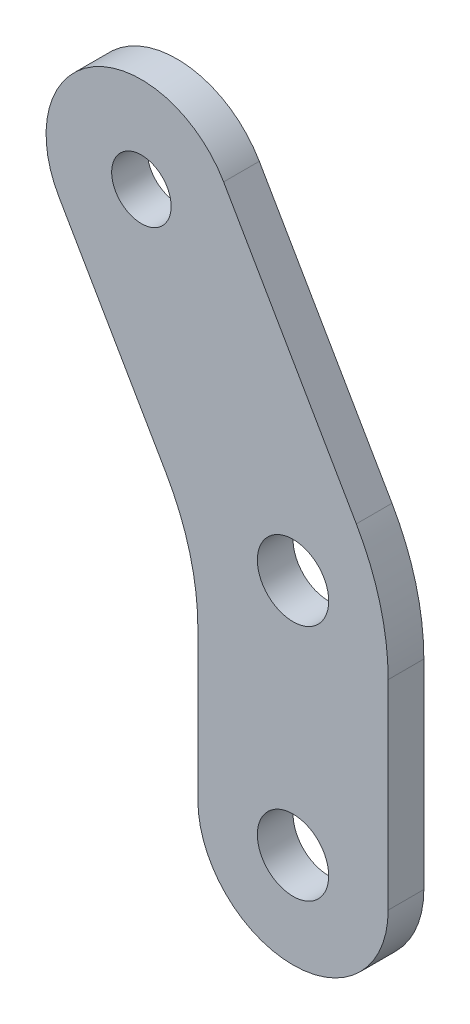
ISO-10303-21;
HEADER;
FILE_DESCRIPTION(('STEP AP214'),'2;1');
FILE_NAME('part.step','',(''),(''),'','','');
FILE_SCHEMA(('AUTOMOTIVE_DESIGN { 1 0 10303 214 1 1 1 1 }'));
ENDSEC;
DATA;
#1=APPLICATION_CONTEXT('core data for automotive mechanical design processes');
#2=APPLICATION_PROTOCOL_DEFINITION('international standard','automotive_design',2000,#1);
#3=PRODUCT_CONTEXT('',#1,'mechanical');
#4=PRODUCT('Part','Part','',(#3));
#5=PRODUCT_RELATED_PRODUCT_CATEGORY('part','',(#4));
#6=PRODUCT_DEFINITION_FORMATION('','',#4);
#7=PRODUCT_DEFINITION_CONTEXT('part definition',#1,'design');
#8=PRODUCT_DEFINITION('design','',#6,#7);
#9=PRODUCT_DEFINITION_SHAPE('','',#8);
#10=(LENGTH_UNIT() NAMED_UNIT(*) SI_UNIT(.MILLI.,.METRE.));
#11=(NAMED_UNIT(*) PLANE_ANGLE_UNIT() SI_UNIT($,.RADIAN.));
#12=(NAMED_UNIT(*) SI_UNIT($,.STERADIAN.) SOLID_ANGLE_UNIT());
#13=UNCERTAINTY_MEASURE_WITH_UNIT(LENGTH_MEASURE(1.E-05),#10,'distance_accuracy_value','');
#14=(GEOMETRIC_REPRESENTATION_CONTEXT(3) GLOBAL_UNCERTAINTY_ASSIGNED_CONTEXT((#13)) GLOBAL_UNIT_ASSIGNED_CONTEXT((#10,
#11,#12)) REPRESENTATION_CONTEXT('',''));
#15=CARTESIAN_POINT('',(0.,0.,0.));
#16=DIRECTION('',(0.,0.,1.));
#17=DIRECTION('',(1.,0.,0.));
#18=AXIS2_PLACEMENT_3D('',#15,#16,#17);
#19=CARTESIAN_POINT('',(0.,0.,3.));
#20=DIRECTION('',(0.,0.,1.));
#21=DIRECTION('',(1.,0.,0.));
#22=AXIS2_PLACEMENT_3D('',#19,#20,#21);
#23=PLANE('',#22);
#24=CARTESIAN_POINT('',(-12.7497839742892,42.1122667237108,3.));
#25=DIRECTION('',(0.,0.,1.));
#26=DIRECTION('',(1.,0.,0.));
#27=AXIS2_PLACEMENT_3D('',#24,#25,#26);
#28=CIRCLE('',#27,2.5);
#29=CARTESIAN_POINT('',(-10.2497839742892,42.1122667237108,3.));
#30=VERTEX_POINT('',#29);
#31=EDGE_CURVE('E220',#30,#30,#28,.T.);
#32=ORIENTED_EDGE('',*,*,#31,.F.);
#33=EDGE_LOOP('',(#32));
#34=FACE_BOUND('',#33,.T.);
#35=DIRECTION('',(0.,1.,0.));
#36=VECTOR('',#35,1.);
#37=CARTESIAN_POINT('',(8.,0.,3.));
#38=LINE('',#37,#36);
#39=CARTESIAN_POINT('',(8.,0.,3.));
#40=VERTEX_POINT('',#39);
#41=CARTESIAN_POINT('',(8.,16.7846096908265,3.));
#42=VERTEX_POINT('',#41);
#43=EDGE_CURVE('E106',#40,#42,#38,.T.);
#44=ORIENTED_EDGE('',*,*,#43,.T.);
#45=CARTESIAN_POINT('',(-12.,16.7846096908265,3.));
#46=DIRECTION('',(0.,0.,1.));
#47=DIRECTION('',(1.,0.,0.));
#48=AXIS2_PLACEMENT_3D('',#45,#46,#47);
#49=CIRCLE('',#48,20.);
#50=CARTESIAN_POINT('',(5.32050807568877,26.7846096908265,3.));
#51=VERTEX_POINT('',#50);
#52=EDGE_CURVE('E155',#42,#51,#49,.T.);
#53=ORIENTED_EDGE('',*,*,#52,.T.);
#54=DIRECTION('',(-0.500000000000001,0.866025403784438,0.));
#55=VECTOR('',#54,1.);
#56=CARTESIAN_POINT('',(-5.83582801750869,46.107950630559,3.));
#57=LINE('',#56,#55);
#58=CARTESIAN_POINT('',(-5.83582801750869,46.107950630559,3.));
#59=VERTEX_POINT('',#58);
#60=EDGE_CURVE('E115',#51,#59,#57,.T.);
#61=ORIENTED_EDGE('',*,*,#60,.T.);
#62=CARTESIAN_POINT('',(-12.7640312477842,42.1079506305589,3.));
#63=DIRECTION('',(0.,0.,1.));
#64=DIRECTION('',(1.,0.,0.));
#65=AXIS2_PLACEMENT_3D('',#62,#63,#64);
#66=CIRCLE('',#65,8.00000000000002);
#67=CARTESIAN_POINT('',(-19.6922344780597,38.1079506305589,3.));
#68=VERTEX_POINT('',#67);
#69=EDGE_CURVE('E188',#59,#68,#66,.T.);
#70=ORIENTED_EDGE('',*,*,#69,.T.);
#71=DIRECTION('',(0.500000000000001,-0.866025403784438,0.));
#72=VECTOR('',#71,1.);
#73=CARTESIAN_POINT('',(-8.,17.856406460551,3.));
#74=LINE('',#73,#72);
#75=CARTESIAN_POINT('',(-10.6794919243112,22.4974226119285,3.));
#76=VERTEX_POINT('',#75);
#77=EDGE_CURVE('E179',#68,#76,#74,.T.);
#78=ORIENTED_EDGE('',*,*,#77,.T.);
#79=CARTESIAN_POINT('',(-28.,12.4974226119285,3.));
#80=DIRECTION('',(0.,0.,1.));
#81=DIRECTION('',(1.,0.,0.));
#82=AXIS2_PLACEMENT_3D('',#79,#80,#81);
#83=CIRCLE('',#82,20.);
#84=CARTESIAN_POINT('',(-8.,12.4974226119285,3.));
#85=VERTEX_POINT('',#84);
#86=EDGE_CURVE('E11',#76,#85,#83,.F.);
#87=ORIENTED_EDGE('',*,*,#86,.T.);
#88=DIRECTION('',(0.,-1.,0.));
#89=VECTOR('',#88,1.);
#90=CARTESIAN_POINT('',(-8.,0.,3.));
#91=LINE('',#90,#89);
#92=CARTESIAN_POINT('',(-8.,0.,3.));
#93=VERTEX_POINT('',#92);
#94=EDGE_CURVE('E121',#85,#93,#91,.T.);
#95=ORIENTED_EDGE('',*,*,#94,.T.);
#96=CARTESIAN_POINT('',(0.,0.,3.));
#97=DIRECTION('',(0.,0.,1.));
#98=DIRECTION('',(1.,0.,0.));
#99=AXIS2_PLACEMENT_3D('',#96,#97,#98);
#100=CIRCLE('',#99,8.);
#101=EDGE_CURVE('E116',#93,#40,#100,.T.);
#102=ORIENTED_EDGE('',*,*,#101,.T.);
#103=EDGE_LOOP('',(#44,#53,#61,#70,#78,#87,#95,#102));
#104=FACE_BOUND('',#103,.T.);
#105=CARTESIAN_POINT('',(0.,0.,3.));
#106=DIRECTION('',(0.,0.,1.));
#107=DIRECTION('',(1.,0.,0.));
#108=AXIS2_PLACEMENT_3D('',#105,#106,#107);
#109=CIRCLE('',#108,3.);
#110=CARTESIAN_POINT('',(3.,0.,3.));
#111=VERTEX_POINT('',#110);
#112=EDGE_CURVE('E195',#111,#111,#109,.T.);
#113=ORIENTED_EDGE('',*,*,#112,.F.);
#114=EDGE_LOOP('',(#113));
#115=FACE_BOUND('',#114,.T.);
#116=CARTESIAN_POINT('',(0.,20.,3.));
#117=DIRECTION('',(0.,0.,1.));
#118=DIRECTION('',(1.,0.,0.));
#119=AXIS2_PLACEMENT_3D('',#116,#117,#118);
#120=CIRCLE('',#119,3.);
#121=CARTESIAN_POINT('',(3.,20.,3.));
#122=VERTEX_POINT('',#121);
#123=EDGE_CURVE('E228',#122,#122,#120,.T.);
#124=ORIENTED_EDGE('',*,*,#123,.F.);
#125=EDGE_LOOP('',(#124));
#126=FACE_BOUND('',#125,.T.);
#127=ADVANCED_FACE('F43',(#34,#104,#115,#126),#23,.T.);
#128=CARTESIAN_POINT('',(0.,0.,0.));
#129=DIRECTION('',(0.,0.,1.));
#130=DIRECTION('',(1.,0.,0.));
#131=AXIS2_PLACEMENT_3D('',#128,#129,#130);
#132=PLANE('',#131);
#133=DIRECTION('',(-0.500000000000001,0.866025403784438,0.));
#134=VECTOR('',#133,1.);
#135=CARTESIAN_POINT('',(-5.83582801750869,46.107950630559,0.));
#136=LINE('',#135,#134);
#137=CARTESIAN_POINT('',(5.32050807568877,26.7846096908265,0.));
#138=VERTEX_POINT('',#137);
#139=CARTESIAN_POINT('',(-5.83582801750869,46.107950630559,0.));
#140=VERTEX_POINT('',#139);
#141=EDGE_CURVE('E198',#138,#140,#136,.T.);
#142=ORIENTED_EDGE('',*,*,#141,.F.);
#143=CARTESIAN_POINT('',(-12.,16.7846096908265,0.));
#144=DIRECTION('',(0.,0.,1.));
#145=DIRECTION('',(1.,0.,0.));
#146=AXIS2_PLACEMENT_3D('',#143,#144,#145);
#147=CIRCLE('',#146,20.);
#148=CARTESIAN_POINT('',(8.,16.7846096908265,0.));
#149=VERTEX_POINT('',#148);
#150=EDGE_CURVE('E67',#138,#149,#147,.F.);
#151=ORIENTED_EDGE('',*,*,#150,.T.);
#152=DIRECTION('',(0.,1.,0.));
#153=VECTOR('',#152,1.);
#154=CARTESIAN_POINT('',(8.,0.,0.));
#155=LINE('',#154,#153);
#156=CARTESIAN_POINT('',(8.,0.,0.));
#157=VERTEX_POINT('',#156);
#158=EDGE_CURVE('E194',#157,#149,#155,.T.);
#159=ORIENTED_EDGE('',*,*,#158,.F.);
#160=CARTESIAN_POINT('',(0.,0.,0.));
#161=DIRECTION('',(0.,0.,1.));
#162=DIRECTION('',(1.,0.,0.));
#163=AXIS2_PLACEMENT_3D('',#160,#161,#162);
#164=CIRCLE('',#163,8.);
#165=CARTESIAN_POINT('',(-8.,0.,0.));
#166=VERTEX_POINT('',#165);
#167=EDGE_CURVE('E130',#166,#157,#164,.T.);
#168=ORIENTED_EDGE('',*,*,#167,.F.);
#169=DIRECTION('',(0.,-1.,0.));
#170=VECTOR('',#169,1.);
#171=CARTESIAN_POINT('',(-8.,0.,0.));
#172=LINE('',#171,#170);
#173=CARTESIAN_POINT('',(-8.,12.4974226119285,0.));
#174=VERTEX_POINT('',#173);
#175=EDGE_CURVE('E126',#174,#166,#172,.T.);
#176=ORIENTED_EDGE('',*,*,#175,.F.);
#177=CARTESIAN_POINT('',(-28.,12.4974226119285,0.));
#178=DIRECTION('',(0.,0.,1.));
#179=DIRECTION('',(1.,0.,0.));
#180=AXIS2_PLACEMENT_3D('',#177,#178,#179);
#181=CIRCLE('',#180,20.);
#182=CARTESIAN_POINT('',(-10.6794919243112,22.4974226119285,0.));
#183=VERTEX_POINT('',#182);
#184=EDGE_CURVE('E52',#174,#183,#181,.T.);
#185=ORIENTED_EDGE('',*,*,#184,.T.);
#186=DIRECTION('',(0.500000000000001,-0.866025403784438,0.));
#187=VECTOR('',#186,1.);
#188=CARTESIAN_POINT('',(-8.,17.856406460551,0.));
#189=LINE('',#188,#187);
#190=CARTESIAN_POINT('',(-19.6922344780597,38.1079506305589,0.));
#191=VERTEX_POINT('',#190);
#192=EDGE_CURVE('E164',#191,#183,#189,.T.);
#193=ORIENTED_EDGE('',*,*,#192,.F.);
#194=CARTESIAN_POINT('',(-12.7640312477842,42.1079506305589,0.));
#195=DIRECTION('',(0.,0.,1.));
#196=DIRECTION('',(1.,0.,0.));
#197=AXIS2_PLACEMENT_3D('',#194,#195,#196);
#198=CIRCLE('',#197,8.00000000000002);
#199=EDGE_CURVE('E175',#140,#191,#198,.T.);
#200=ORIENTED_EDGE('',*,*,#199,.F.);
#201=EDGE_LOOP('',(#142,#151,#159,#168,#176,#185,#193,#200));
#202=FACE_BOUND('',#201,.T.);
#203=CARTESIAN_POINT('',(0.,0.,0.));
#204=DIRECTION('',(0.,0.,1.));
#205=DIRECTION('',(1.,0.,0.));
#206=AXIS2_PLACEMENT_3D('',#203,#204,#205);
#207=CIRCLE('',#206,3.);
#208=CARTESIAN_POINT('',(3.,0.,0.));
#209=VERTEX_POINT('',#208);
#210=EDGE_CURVE('E216',#209,#209,#207,.T.);
#211=ORIENTED_EDGE('',*,*,#210,.T.);
#212=EDGE_LOOP('',(#211));
#213=FACE_BOUND('',#212,.T.);
#214=CARTESIAN_POINT('',(-12.7497839742892,42.1122667237108,0.));
#215=DIRECTION('',(0.,0.,1.));
#216=DIRECTION('',(1.,0.,0.));
#217=AXIS2_PLACEMENT_3D('',#214,#215,#216);
#218=CIRCLE('',#217,2.5);
#219=CARTESIAN_POINT('',(-10.2497839742892,42.1122667237108,0.));
#220=VERTEX_POINT('',#219);
#221=EDGE_CURVE('E224',#220,#220,#218,.T.);
#222=ORIENTED_EDGE('',*,*,#221,.T.);
#223=EDGE_LOOP('',(#222));
#224=FACE_BOUND('',#223,.T.);
#225=CARTESIAN_POINT('',(0.,20.,0.));
#226=DIRECTION('',(0.,0.,1.));
#227=DIRECTION('',(1.,0.,0.));
#228=AXIS2_PLACEMENT_3D('',#225,#226,#227);
#229=CIRCLE('',#228,3.);
#230=CARTESIAN_POINT('',(3.,20.,0.));
#231=VERTEX_POINT('',#230);
#232=EDGE_CURVE('E232',#231,#231,#229,.T.);
#233=ORIENTED_EDGE('',*,*,#232,.T.);
#234=EDGE_LOOP('',(#233));
#235=FACE_BOUND('',#234,.T.);
#236=ADVANCED_FACE('F161',(#202,#213,#224,#235),#132,.F.);
#237=CARTESIAN_POINT('',(0.,0.,3.));
#238=DIRECTION('',(0.,0.,-1.));
#239=DIRECTION('',(-1.,0.,0.));
#240=AXIS2_PLACEMENT_3D('',#237,#238,#239);
#241=CYLINDRICAL_SURFACE('',#240,8.);
#242=ORIENTED_EDGE('',*,*,#167,.T.);
#243=DIRECTION('',(0.,0.,-1.));
#244=VECTOR('',#243,1.);
#245=CARTESIAN_POINT('',(8.,0.,3.));
#246=LINE('',#245,#244);
#247=EDGE_CURVE('E110',#40,#157,#246,.T.);
#248=ORIENTED_EDGE('',*,*,#247,.F.);
#249=ORIENTED_EDGE('',*,*,#101,.F.);
#250=DIRECTION('',(0.,0.,-1.));
#251=VECTOR('',#250,1.);
#252=CARTESIAN_POINT('',(-8.,0.,3.));
#253=LINE('',#252,#251);
#254=EDGE_CURVE('E182',#93,#166,#253,.T.);
#255=ORIENTED_EDGE('',*,*,#254,.T.);
#256=EDGE_LOOP('',(#242,#248,#249,#255));
#257=FACE_BOUND('',#256,.T.);
#258=ADVANCED_FACE('F128',(#257),#241,.T.);
#259=CARTESIAN_POINT('',(8.,0.,3.));
#260=DIRECTION('',(-1.,0.,0.));
#261=DIRECTION('',(0.,0.,1.));
#262=AXIS2_PLACEMENT_3D('',#259,#260,#261);
#263=PLANE('',#262);
#264=ORIENTED_EDGE('',*,*,#158,.T.);
#265=DIRECTION('',(0.,0.,-1.));
#266=VECTOR('',#265,1.);
#267=CARTESIAN_POINT('',(8.,16.7846096908265,3.));
#268=LINE('',#267,#266);
#269=EDGE_CURVE('E59',#149,#42,#268,.F.);
#270=ORIENTED_EDGE('',*,*,#269,.T.);
#271=ORIENTED_EDGE('',*,*,#43,.F.);
#272=ORIENTED_EDGE('',*,*,#247,.T.);
#273=EDGE_LOOP('',(#264,#270,#271,#272));
#274=FACE_BOUND('',#273,.T.);
#275=ADVANCED_FACE('F108',(#274),#263,.F.);
#276=CARTESIAN_POINT('',(-5.83582801750869,46.107950630559,3.));
#277=DIRECTION('',(-0.866025403784438,-0.500000000000001,0.));
#278=DIRECTION('',(0.500000000000001,-0.866025403784438,0.));
#279=AXIS2_PLACEMENT_3D('',#276,#277,#278);
#280=PLANE('',#279);
#281=ORIENTED_EDGE('',*,*,#60,.F.);
#282=DIRECTION('',(0.,0.,-1.));
#283=VECTOR('',#282,1.);
#284=CARTESIAN_POINT('',(5.32050807568876,26.7846096908265,3.));
#285=LINE('',#284,#283);
#286=EDGE_CURVE('E147',#51,#138,#285,.T.);
#287=ORIENTED_EDGE('',*,*,#286,.T.);
#288=ORIENTED_EDGE('',*,*,#141,.T.);
#289=DIRECTION('',(0.,0.,-1.));
#290=VECTOR('',#289,1.);
#291=CARTESIAN_POINT('',(-5.83582801750869,46.107950630559,3.));
#292=LINE('',#291,#290);
#293=EDGE_CURVE('E133',#59,#140,#292,.T.);
#294=ORIENTED_EDGE('',*,*,#293,.F.);
#295=EDGE_LOOP('',(#281,#287,#288,#294));
#296=FACE_BOUND('',#295,.T.);
#297=ADVANCED_FACE('F210',(#296),#280,.F.);
#298=CARTESIAN_POINT('',(-12.7640312477842,42.1079506305589,3.));
#299=DIRECTION('',(0.,0.,-1.));
#300=DIRECTION('',(-1.,0.,0.));
#301=AXIS2_PLACEMENT_3D('',#298,#299,#300);
#302=CYLINDRICAL_SURFACE('',#301,8.00000000000002);
#303=ORIENTED_EDGE('',*,*,#199,.T.);
#304=DIRECTION('',(0.,0.,-1.));
#305=VECTOR('',#304,1.);
#306=CARTESIAN_POINT('',(-19.6922344780597,38.1079506305589,3.));
#307=LINE('',#306,#305);
#308=EDGE_CURVE('E141',#68,#191,#307,.T.);
#309=ORIENTED_EDGE('',*,*,#308,.F.);
#310=ORIENTED_EDGE('',*,*,#69,.F.);
#311=ORIENTED_EDGE('',*,*,#293,.T.);
#312=EDGE_LOOP('',(#303,#309,#310,#311));
#313=FACE_BOUND('',#312,.T.);
#314=ADVANCED_FACE('F259',(#313),#302,.T.);
#315=CARTESIAN_POINT('',(-8.,17.856406460551,3.));
#316=DIRECTION('',(0.866025403784438,0.500000000000001,0.));
#317=DIRECTION('',(-0.500000000000001,0.866025403784438,0.));
#318=AXIS2_PLACEMENT_3D('',#315,#316,#317);
#319=PLANE('',#318);
#320=ORIENTED_EDGE('',*,*,#192,.T.);
#321=DIRECTION('',(0.,0.,-1.));
#322=VECTOR('',#321,1.);
#323=CARTESIAN_POINT('',(-10.6794919243112,22.4974226119285,3.));
#324=LINE('',#323,#322);
#325=EDGE_CURVE('E138',#183,#76,#324,.F.);
#326=ORIENTED_EDGE('',*,*,#325,.T.);
#327=ORIENTED_EDGE('',*,*,#77,.F.);
#328=ORIENTED_EDGE('',*,*,#308,.T.);
#329=EDGE_LOOP('',(#320,#326,#327,#328));
#330=FACE_BOUND('',#329,.T.);
#331=ADVANCED_FACE('F170',(#330),#319,.F.);
#332=CARTESIAN_POINT('',(-8.,0.,3.));
#333=DIRECTION('',(1.,0.,0.));
#334=DIRECTION('',(0.,0.,-1.));
#335=AXIS2_PLACEMENT_3D('',#332,#333,#334);
#336=PLANE('',#335);
#337=ORIENTED_EDGE('',*,*,#94,.F.);
#338=DIRECTION('',(0.,0.,-1.));
#339=VECTOR('',#338,1.);
#340=CARTESIAN_POINT('',(-8.,12.4974226119285,0.));
#341=LINE('',#340,#339);
#342=EDGE_CURVE('E132',#85,#174,#341,.T.);
#343=ORIENTED_EDGE('',*,*,#342,.T.);
#344=ORIENTED_EDGE('',*,*,#175,.T.);
#345=ORIENTED_EDGE('',*,*,#254,.F.);
#346=EDGE_LOOP('',(#337,#343,#344,#345));
#347=FACE_BOUND('',#346,.T.);
#348=ADVANCED_FACE('F181',(#347),#336,.F.);
#349=CARTESIAN_POINT('',(0.,0.,3.));
#350=DIRECTION('',(0.,0.,-1.));
#351=DIRECTION('',(-1.,0.,0.));
#352=AXIS2_PLACEMENT_3D('',#349,#350,#351);
#353=CYLINDRICAL_SURFACE('',#352,3.);
#354=ORIENTED_EDGE('',*,*,#112,.T.);
#355=EDGE_LOOP('',(#354));
#356=FACE_BOUND('',#355,.T.);
#357=ORIENTED_EDGE('',*,*,#210,.F.);
#358=EDGE_LOOP('',(#357));
#359=FACE_BOUND('',#358,.T.);
#360=ADVANCED_FACE('F252',(#356,#359),#353,.F.);
#361=CARTESIAN_POINT('',(-12.7497839742892,42.1122667237108,3.));
#362=DIRECTION('',(0.,0.,-1.));
#363=DIRECTION('',(-1.,0.,0.));
#364=AXIS2_PLACEMENT_3D('',#361,#362,#363);
#365=CYLINDRICAL_SURFACE('',#364,2.5);
#366=ORIENTED_EDGE('',*,*,#31,.T.);
#367=EDGE_LOOP('',(#366));
#368=FACE_BOUND('',#367,.T.);
#369=ORIENTED_EDGE('',*,*,#221,.F.);
#370=EDGE_LOOP('',(#369));
#371=FACE_BOUND('',#370,.T.);
#372=ADVANCED_FACE('F273',(#368,#371),#365,.F.);
#373=CARTESIAN_POINT('',(0.,20.,3.));
#374=DIRECTION('',(0.,0.,-1.));
#375=DIRECTION('',(-1.,0.,0.));
#376=AXIS2_PLACEMENT_3D('',#373,#374,#375);
#377=CYLINDRICAL_SURFACE('',#376,3.);
#378=ORIENTED_EDGE('',*,*,#123,.T.);
#379=EDGE_LOOP('',(#378));
#380=FACE_BOUND('',#379,.T.);
#381=ORIENTED_EDGE('',*,*,#232,.F.);
#382=EDGE_LOOP('',(#381));
#383=FACE_BOUND('',#382,.T.);
#384=ADVANCED_FACE('F240',(#380,#383),#377,.F.);
#385=CARTESIAN_POINT('',(-28.,12.4974226119285,3.));
#386=DIRECTION('',(0.,0.,1.));
#387=DIRECTION('',(1.,0.,0.));
#388=AXIS2_PLACEMENT_3D('',#385,#386,#387);
#389=CYLINDRICAL_SURFACE('',#388,20.);
#390=ORIENTED_EDGE('',*,*,#86,.F.);
#391=ORIENTED_EDGE('',*,*,#325,.F.);
#392=ORIENTED_EDGE('',*,*,#184,.F.);
#393=ORIENTED_EDGE('',*,*,#342,.F.);
#394=EDGE_LOOP('',(#390,#391,#392,#393));
#395=FACE_BOUND('',#394,.T.);
#396=ADVANCED_FACE('F178',(#395),#389,.F.);
#397=CARTESIAN_POINT('',(-12.,16.7846096908265,3.));
#398=DIRECTION('',(0.,0.,-1.));
#399=DIRECTION('',(-1.,0.,0.));
#400=AXIS2_PLACEMENT_3D('',#397,#398,#399);
#401=CYLINDRICAL_SURFACE('',#400,20.);
#402=ORIENTED_EDGE('',*,*,#52,.F.);
#403=ORIENTED_EDGE('',*,*,#269,.F.);
#404=ORIENTED_EDGE('',*,*,#150,.F.);
#405=ORIENTED_EDGE('',*,*,#286,.F.);
#406=EDGE_LOOP('',(#402,#403,#404,#405));
#407=FACE_BOUND('',#406,.T.);
#408=ADVANCED_FACE('F45',(#407),#401,.T.);
#409=CLOSED_SHELL('',(#127,#236,#258,#275,#297,#314,#331,#348,#360,#372,#384,#396,#408));
#410=MANIFOLD_SOLID_BREP('B2',#409);
#411=ADVANCED_BREP_SHAPE_REPRESENTATION('',(#18,#410),#14);
#412=SHAPE_DEFINITION_REPRESENTATION(#9,#411);
ENDSEC;
END-ISO-10303-21;
